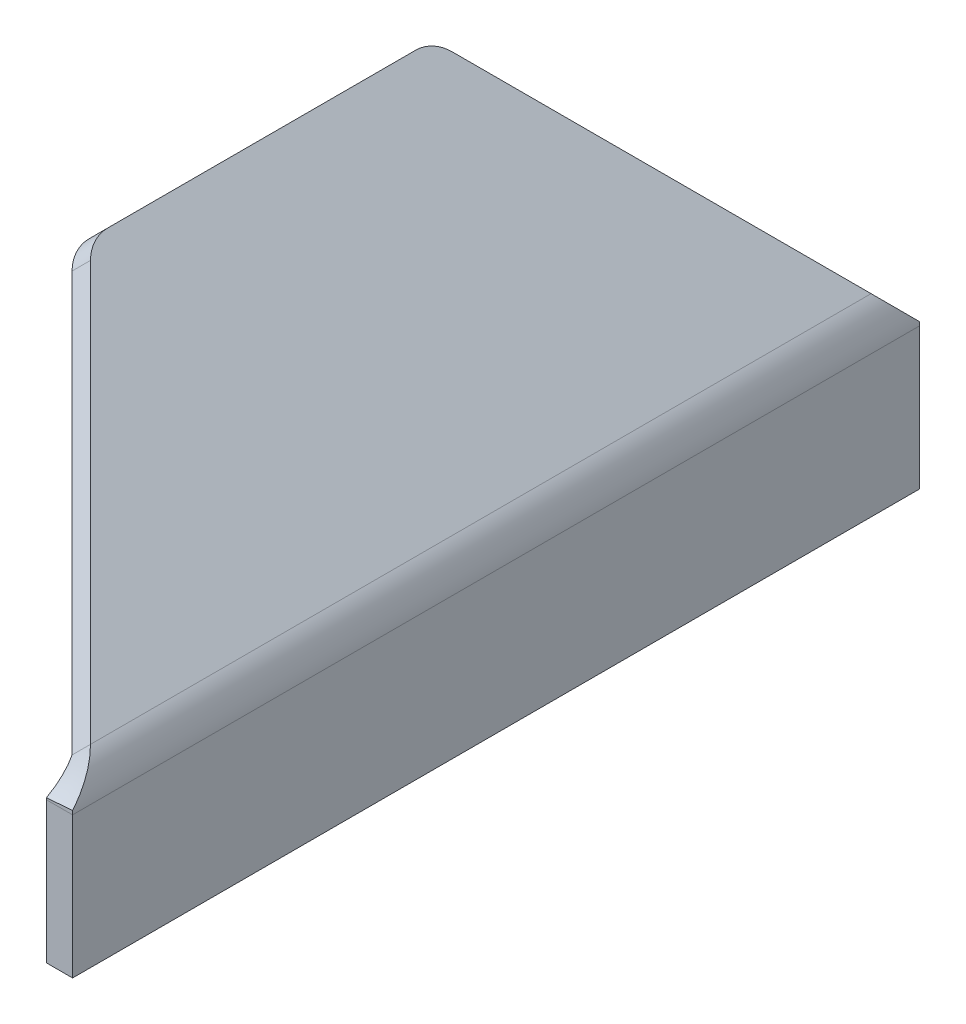
ISO-10303-21;
HEADER;
FILE_DESCRIPTION(('STEP AP214'),'2;1');
FILE_NAME('part.step','',(''),(''),'','','');
FILE_SCHEMA(('AUTOMOTIVE_DESIGN { 1 0 10303 214 1 1 1 1 }'));
ENDSEC;
DATA;
#1=APPLICATION_CONTEXT('core data for automotive mechanical design processes');
#2=APPLICATION_PROTOCOL_DEFINITION('international standard','automotive_design',2000,#1);
#3=PRODUCT_CONTEXT('',#1,'mechanical');
#4=PRODUCT('Part','Part','',(#3));
#5=PRODUCT_RELATED_PRODUCT_CATEGORY('part','',(#4));
#6=PRODUCT_DEFINITION_FORMATION('','',#4);
#7=PRODUCT_DEFINITION_CONTEXT('part definition',#1,'design');
#8=PRODUCT_DEFINITION('design','',#6,#7);
#9=PRODUCT_DEFINITION_SHAPE('','',#8);
#10=(LENGTH_UNIT() NAMED_UNIT(*) SI_UNIT(.MILLI.,.METRE.));
#11=(NAMED_UNIT(*) PLANE_ANGLE_UNIT() SI_UNIT($,.RADIAN.));
#12=(NAMED_UNIT(*) SI_UNIT($,.STERADIAN.) SOLID_ANGLE_UNIT());
#13=UNCERTAINTY_MEASURE_WITH_UNIT(LENGTH_MEASURE(1.E-05),#10,'distance_accuracy_value','');
#14=(GEOMETRIC_REPRESENTATION_CONTEXT(3) GLOBAL_UNCERTAINTY_ASSIGNED_CONTEXT((#13)) GLOBAL_UNIT_ASSIGNED_CONTEXT((#10,
#11,#12)) REPRESENTATION_CONTEXT('',''));
#15=CARTESIAN_POINT('',(0.,0.,0.));
#16=DIRECTION('',(0.,0.,1.));
#17=DIRECTION('',(1.,0.,0.));
#18=AXIS2_PLACEMENT_3D('',#15,#16,#17);
#19=CARTESIAN_POINT('',(0.,43.3725830020305,130.));
#20=DIRECTION('',(0.,0.,1.));
#21=DIRECTION('',(1.,0.,0.));
#22=AXIS2_PLACEMENT_3D('',#19,#20,#21);
#23=PLANE('',#22);
#24=CARTESIAN_POINT('',(-16.,43.3725830020305,130.));
#25=DIRECTION('',(0.,0.,-1.));
#26=DIRECTION('',(-1.,0.,0.));
#27=AXIS2_PLACEMENT_3D('',#24,#25,#26);
#28=CIRCLE('',#27,16.);
#29=CARTESIAN_POINT('',(0.,43.3725830020305,130.));
#30=VERTEX_POINT('',#29);
#31=CARTESIAN_POINT('',(-0.039770336467973,44.5000000000008,130.));
#32=VERTEX_POINT('',#31);
#33=EDGE_CURVE('E280',#30,#32,#28,.F.);
#34=ORIENTED_EDGE('',*,*,#33,.T.);
#35=DIRECTION('',(0.997514353970751,0.0704635623731452,0.));
#36=VECTOR('',#35,1.);
#37=CARTESIAN_POINT('',(-0.039770336467973,44.5000000000008,130.));
#38=LINE('',#37,#36);
#39=CARTESIAN_POINT('',(-8.01988516823399,43.9362915010156,130.));
#40=VERTEX_POINT('',#39);
#41=EDGE_CURVE('E270',#32,#40,#38,.F.);
#42=ORIENTED_EDGE('',*,*,#41,.T.);
#43=CARTESIAN_POINT('',(-16.,43.3725830020305,130.));
#44=DIRECTION('',(0.,0.,1.));
#45=DIRECTION('',(1.,0.,0.));
#46=AXIS2_PLACEMENT_3D('',#43,#44,#45);
#47=CIRCLE('',#46,8.);
#48=CARTESIAN_POINT('',(-8.00000000000001,43.3725830020305,130.));
#49=VERTEX_POINT('',#48);
#50=EDGE_CURVE('E306',#49,#40,#47,.T.);
#51=ORIENTED_EDGE('',*,*,#50,.F.);
#52=DIRECTION('',(-1.,0.,0.));
#53=VECTOR('',#52,1.);
#54=CARTESIAN_POINT('',(0.,43.3725830020305,130.));
#55=LINE('',#54,#53);
#56=EDGE_CURVE('E173',#30,#49,#55,.T.);
#57=ORIENTED_EDGE('',*,*,#56,.F.);
#58=EDGE_LOOP('',(#34,#42,#51,#57));
#59=FACE_BOUND('',#58,.T.);
#60=ADVANCED_FACE('F36',(#59),#23,.T.);
#61=CARTESIAN_POINT('',(-4.68629150101527,54.6862915010152,-130.));
#62=DIRECTION('',(0.,0.,-1.));
#63=DIRECTION('',(-1.,0.,0.));
#64=AXIS2_PLACEMENT_3D('',#61,#62,#63);
#65=PLANE('',#64);
#66=CARTESIAN_POINT('',(-16.,43.3725830020305,-130.));
#67=DIRECTION('',(0.,0.,1.));
#68=DIRECTION('',(1.,0.,0.));
#69=AXIS2_PLACEMENT_3D('',#66,#67,#68);
#70=CIRCLE('',#69,8.);
#71=CARTESIAN_POINT('',(-8.00000000000001,43.3725830020305,-130.));
#72=VERTEX_POINT('',#71);
#73=CARTESIAN_POINT('',(-8.01988516823399,43.9362915010157,-130.));
#74=VERTEX_POINT('',#73);
#75=EDGE_CURVE('E292',#72,#74,#70,.T.);
#76=ORIENTED_EDGE('',*,*,#75,.T.);
#77=DIRECTION('',(0.997514353970751,0.07046356237315,0.));
#78=VECTOR('',#77,1.);
#79=CARTESIAN_POINT('',(-0.039770336467973,44.5000000000009,-130.));
#80=LINE('',#79,#78);
#81=CARTESIAN_POINT('',(-0.039770336467973,44.5000000000009,-130.));
#82=VERTEX_POINT('',#81);
#83=EDGE_CURVE('E146',#82,#74,#80,.F.);
#84=ORIENTED_EDGE('',*,*,#83,.F.);
#85=CARTESIAN_POINT('',(-16.,43.3725830020305,-130.));
#86=DIRECTION('',(0.,0.,-1.));
#87=DIRECTION('',(-1.,0.,0.));
#88=AXIS2_PLACEMENT_3D('',#85,#86,#87);
#89=CIRCLE('',#88,16.);
#90=CARTESIAN_POINT('',(0.,43.3725830020305,-130.));
#91=VERTEX_POINT('',#90);
#92=EDGE_CURVE('E304',#91,#82,#89,.F.);
#93=ORIENTED_EDGE('',*,*,#92,.F.);
#94=DIRECTION('',(1.,0.,0.));
#95=VECTOR('',#94,1.);
#96=CARTESIAN_POINT('',(-8.00000000000001,43.3725830020305,-130.));
#97=LINE('',#96,#95);
#98=EDGE_CURVE('E171',#72,#91,#97,.T.);
#99=ORIENTED_EDGE('',*,*,#98,.F.);
#100=EDGE_LOOP('',(#76,#84,#93,#99));
#101=FACE_BOUND('',#100,.T.);
#102=ADVANCED_FACE('F203',(#101),#65,.T.);
#103=CARTESIAN_POINT('',(0.,50.,130.));
#104=DIRECTION('',(-0.707106781186546,-0.707106781186549,0.));
#105=DIRECTION('',(0.707106781186549,-0.707106781186546,0.));
#106=AXIS2_PLACEMENT_3D('',#103,#104,#105);
#107=PLANE('',#106);
#108=DIRECTION('',(0.577350269189625,-0.577350269189623,-0.577350269189629));
#109=VECTOR('',#108,1.);
#110=CARTESIAN_POINT('',(-73.8859514164977,123.885951416497,-50.6140485835025));
#111=LINE('',#110,#109);
#112=CARTESIAN_POINT('',(-69.0114150927734,119.011415092773,-55.4885849072269));
#113=VERTEX_POINT('',#112);
#114=CARTESIAN_POINT('',(-4.68629150101527,54.6862915010152,-119.813708498986));
#115=VERTEX_POINT('',#114);
#116=EDGE_CURVE('E137',#113,#115,#111,.T.);
#117=ORIENTED_EDGE('',*,*,#116,.F.);
#118=CARTESIAN_POINT('',(-64.9289321881348,114.928932188135,-47.3236190979496));
#119=DIRECTION('',(-0.707106781186546,-0.707106781186549,0.));
#120=DIRECTION('',(0.707106781186549,-0.707106781186546,0.));
#121=AXIS2_PLACEMENT_3D('',#118,#119,#120);
#122=CIRCLE('',#121,10.);
#123=CARTESIAN_POINT('',(-72.0000000000003,122.,-47.3236190979496));
#124=VERTEX_POINT('',#123);
#125=EDGE_CURVE('E44',#113,#124,#122,.F.);
#126=ORIENTED_EDGE('',*,*,#125,.T.);
#127=DIRECTION('',(0.,0.,-1.));
#128=VECTOR('',#127,1.);
#129=CARTESIAN_POINT('',(-72.0000000000003,122.,130.));
#130=LINE('',#129,#128);
#131=CARTESIAN_POINT('',(-72.0000000000003,122.,47.3236190979496));
#132=VERTEX_POINT('',#131);
#133=EDGE_CURVE('E162',#132,#124,#130,.T.);
#134=ORIENTED_EDGE('',*,*,#133,.F.);
#135=CARTESIAN_POINT('',(-64.9289321881348,114.928932188135,47.3236190979496));
#136=DIRECTION('',(-0.707106781186546,-0.707106781186549,0.));
#137=DIRECTION('',(0.707106781186549,-0.707106781186546,0.));
#138=AXIS2_PLACEMENT_3D('',#135,#136,#137);
#139=CIRCLE('',#138,10.);
#140=CARTESIAN_POINT('',(-69.0114150927734,119.011415092773,55.4885849072268));
#141=VERTEX_POINT('',#140);
#142=EDGE_CURVE('E51',#132,#141,#139,.F.);
#143=ORIENTED_EDGE('',*,*,#142,.T.);
#144=DIRECTION('',(-0.577350269189625,0.577350269189623,-0.577350269189629));
#145=VECTOR('',#144,1.);
#146=CARTESIAN_POINT('',(-73.8859514164977,123.885951416497,50.6140485835025));
#147=LINE('',#146,#145);
#148=CARTESIAN_POINT('',(-4.68629150101527,54.6862915010152,119.813708498985));
#149=VERTEX_POINT('',#148);
#150=EDGE_CURVE('E275',#149,#141,#147,.T.);
#151=ORIENTED_EDGE('',*,*,#150,.F.);
#152=DIRECTION('',(0.,0.,-1.));
#153=VECTOR('',#152,1.);
#154=CARTESIAN_POINT('',(-4.68629150101527,54.6862915010152,130.));
#155=LINE('',#154,#153);
#156=EDGE_CURVE('E281',#149,#115,#155,.T.);
#157=ORIENTED_EDGE('',*,*,#156,.T.);
#158=EDGE_LOOP('',(#117,#126,#134,#143,#151,#157));
#159=FACE_BOUND('',#158,.T.);
#160=ADVANCED_FACE('F185',(#159),#107,.F.);
#161=CARTESIAN_POINT('',(-77.6568542494927,116.343145750508,130.));
#162=DIRECTION('',(-0.707106781186548,0.707106781186547,0.));
#163=DIRECTION('',(-0.707106781186547,-0.707106781186548,0.));
#164=AXIS2_PLACEMENT_3D('',#161,#162,#163);
#165=PLANE('',#164);
#166=ORIENTED_EDGE('',*,*,#133,.T.);
#167=DIRECTION('',(-0.707106781186547,-0.707106781186548,0.));
#168=VECTOR('',#167,1.);
#169=CARTESIAN_POINT('',(-77.6568542494927,116.343145750508,-47.3236190979496));
#170=LINE('',#169,#168);
#171=CARTESIAN_POINT('',(-77.6568542494927,116.343145750508,-47.3236190979496));
#172=VERTEX_POINT('',#171);
#173=EDGE_CURVE('E177',#124,#172,#170,.T.);
#174=ORIENTED_EDGE('',*,*,#173,.T.);
#175=DIRECTION('',(0.,0.,-1.));
#176=VECTOR('',#175,1.);
#177=CARTESIAN_POINT('',(-77.6568542494927,116.343145750508,130.));
#178=LINE('',#177,#176);
#179=CARTESIAN_POINT('',(-77.6568542494927,116.343145750508,47.3236190979496));
#180=VERTEX_POINT('',#179);
#181=EDGE_CURVE('E159',#180,#172,#178,.T.);
#182=ORIENTED_EDGE('',*,*,#181,.F.);
#183=DIRECTION('',(-0.707106781186547,-0.707106781186548,0.));
#184=VECTOR('',#183,1.);
#185=CARTESIAN_POINT('',(-77.6568542494926,116.343145750508,47.3236190979496));
#186=LINE('',#185,#184);
#187=EDGE_CURVE('E175',#180,#132,#186,.F.);
#188=ORIENTED_EDGE('',*,*,#187,.T.);
#189=EDGE_LOOP('',(#166,#174,#182,#188));
#190=FACE_BOUND('',#189,.T.);
#191=ADVANCED_FACE('F190',(#190),#165,.T.);
#192=CARTESIAN_POINT('',(-5.65685424949237,44.3431457505076,130.));
#193=DIRECTION('',(-0.707106781186546,-0.707106781186549,0.));
#194=DIRECTION('',(0.707106781186549,-0.707106781186546,0.));
#195=AXIS2_PLACEMENT_3D('',#192,#193,#194);
#196=PLANE('',#195);
#197=ORIENTED_EDGE('',*,*,#181,.T.);
#198=CARTESIAN_POINT('',(-70.5857864376271,109.272077938642,-47.3236190979496));
#199=DIRECTION('',(-0.707106781186546,-0.707106781186549,0.));
#200=DIRECTION('',(0.707106781186549,-0.707106781186546,0.));
#201=AXIS2_PLACEMENT_3D('',#198,#199,#200);
#202=CIRCLE('',#201,10.);
#203=CARTESIAN_POINT('',(-74.6682693422658,113.354560843281,-55.4885849072268));
#204=VERTEX_POINT('',#203);
#205=EDGE_CURVE('E134',#172,#204,#202,.T.);
#206=ORIENTED_EDGE('',*,*,#205,.T.);
#207=DIRECTION('',(0.577350269189625,-0.577350269189623,-0.577350269189629));
#208=VECTOR('',#207,1.);
#209=CARTESIAN_POINT('',(-79.5428056659901,118.229097167005,-50.6140485835025));
#210=LINE('',#209,#208);
#211=CARTESIAN_POINT('',(-10.3431457505076,49.0294372515229,-119.813708498986));
#212=VERTEX_POINT('',#211);
#213=EDGE_CURVE('E127',#204,#212,#210,.T.);
#214=ORIENTED_EDGE('',*,*,#213,.T.);
#215=DIRECTION('',(0.,0.,-1.));
#216=VECTOR('',#215,1.);
#217=CARTESIAN_POINT('',(-10.3431457505076,49.0294372515229,130.));
#218=LINE('',#217,#216);
#219=CARTESIAN_POINT('',(-10.3431457505076,49.0294372515229,119.813708498985));
#220=VERTEX_POINT('',#219);
#221=EDGE_CURVE('E133',#220,#212,#218,.T.);
#222=ORIENTED_EDGE('',*,*,#221,.F.);
#223=DIRECTION('',(-0.577350269189625,0.577350269189623,-0.577350269189629));
#224=VECTOR('',#223,1.);
#225=CARTESIAN_POINT('',(-79.5428056659901,118.229097167005,50.6140485835025));
#226=LINE('',#225,#224);
#227=CARTESIAN_POINT('',(-74.6682693422658,113.354560843281,55.4885849072268));
#228=VERTEX_POINT('',#227);
#229=EDGE_CURVE('E326',#220,#228,#226,.T.);
#230=ORIENTED_EDGE('',*,*,#229,.T.);
#231=CARTESIAN_POINT('',(-70.5857864376271,109.272077938642,47.3236190979496));
#232=DIRECTION('',(-0.707106781186546,-0.707106781186549,0.));
#233=DIRECTION('',(0.707106781186549,-0.707106781186546,0.));
#234=AXIS2_PLACEMENT_3D('',#231,#232,#233);
#235=CIRCLE('',#234,10.);
#236=EDGE_CURVE('E180',#228,#180,#235,.T.);
#237=ORIENTED_EDGE('',*,*,#236,.T.);
#238=EDGE_LOOP('',(#197,#206,#214,#222,#230,#237));
#239=FACE_BOUND('',#238,.T.);
#240=ADVANCED_FACE('F130',(#239),#196,.T.);
#241=CARTESIAN_POINT('',(-16.,43.3725830020305,130.));
#242=DIRECTION('',(0.,0.,-1.));
#243=DIRECTION('',(-1.,0.,0.));
#244=AXIS2_PLACEMENT_3D('',#241,#242,#243);
#245=CYLINDRICAL_SURFACE('',#244,8.);
#246=ORIENTED_EDGE('',*,*,#221,.T.);
#247=CARTESIAN_POINT('',(-16.,43.3725830020305,-131.12741699797));
#248=DIRECTION('',(0.,-0.894427190999918,0.447213595499954));
#249=DIRECTION('',(0.,-0.447213595499954,-0.894427190999918));
#250=AXIS2_PLACEMENT_3D('',#247,#248,#249);
#251=ELLIPSE('',#250,17.8885438199985,8.);
#252=EDGE_CURVE('E142',#212,#74,#251,.F.);
#253=ORIENTED_EDGE('',*,*,#252,.T.);
#254=ORIENTED_EDGE('',*,*,#75,.F.);
#255=DIRECTION('',(0.,0.,-1.));
#256=VECTOR('',#255,1.);
#257=CARTESIAN_POINT('',(-8.00000000000001,43.3725830020305,130.));
#258=LINE('',#257,#256);
#259=EDGE_CURVE('E160',#49,#72,#258,.T.);
#260=ORIENTED_EDGE('',*,*,#259,.F.);
#261=ORIENTED_EDGE('',*,*,#50,.T.);
#262=CARTESIAN_POINT('',(-16.,43.3725830020305,131.12741699797));
#263=DIRECTION('',(0.,-0.894427190999918,-0.447213595499954));
#264=DIRECTION('',(0.,0.447213595499954,-0.894427190999918));
#265=AXIS2_PLACEMENT_3D('',#262,#263,#264);
#266=ELLIPSE('',#265,17.8885438199985,8.);
#267=EDGE_CURVE('E158',#40,#220,#266,.F.);
#268=ORIENTED_EDGE('',*,*,#267,.T.);
#269=EDGE_LOOP('',(#246,#253,#254,#260,#261,#268));
#270=FACE_BOUND('',#269,.T.);
#271=ADVANCED_FACE('F156',(#270),#245,.F.);
#272=CARTESIAN_POINT('',(-16.,43.3725830020305,130.));
#273=DIRECTION('',(0.,0.,-1.));
#274=DIRECTION('',(-1.,0.,0.));
#275=AXIS2_PLACEMENT_3D('',#272,#273,#274);
#276=CYLINDRICAL_SURFACE('',#275,16.);
#277=CARTESIAN_POINT('',(-16.,43.3725830020305,-131.12741699797));
#278=DIRECTION('',(0.,-0.707106781186551,0.707106781186544));
#279=DIRECTION('',(0.,-0.707106781186544,-0.707106781186551));
#280=AXIS2_PLACEMENT_3D('',#277,#278,#279);
#281=ELLIPSE('',#280,22.6274169979697,16.);
#282=EDGE_CURVE('E150',#115,#82,#281,.F.);
#283=ORIENTED_EDGE('',*,*,#282,.F.);
#284=ORIENTED_EDGE('',*,*,#156,.F.);
#285=CARTESIAN_POINT('',(-16.,43.3725830020305,131.12741699797));
#286=DIRECTION('',(0.,-0.707106781186551,-0.707106781186544));
#287=DIRECTION('',(0.,0.707106781186544,-0.707106781186551));
#288=AXIS2_PLACEMENT_3D('',#285,#286,#287);
#289=ELLIPSE('',#288,22.6274169979696,16.);
#290=EDGE_CURVE('E153',#32,#149,#289,.F.);
#291=ORIENTED_EDGE('',*,*,#290,.F.);
#292=ORIENTED_EDGE('',*,*,#33,.F.);
#293=DIRECTION('',(0.,0.,-1.));
#294=VECTOR('',#293,1.);
#295=CARTESIAN_POINT('',(0.,43.3725830020305,130.));
#296=LINE('',#295,#294);
#297=EDGE_CURVE('E286',#30,#91,#296,.T.);
#298=ORIENTED_EDGE('',*,*,#297,.T.);
#299=ORIENTED_EDGE('',*,*,#92,.T.);
#300=EDGE_LOOP('',(#283,#284,#291,#292,#298,#299));
#301=FACE_BOUND('',#300,.T.);
#302=ADVANCED_FACE('F215',(#301),#276,.T.);
#303=CARTESIAN_POINT('',(-10.3431457505076,49.0294372515229,130.));
#304=DIRECTION('',(0.,0.,1.));
#305=DIRECTION('',(1.,0.,0.));
#306=AXIS2_PLACEMENT_3D('',#303,#304,#305);
#307=PLANE('',#306);
#308=DIRECTION('',(0.,1.,0.));
#309=VECTOR('',#308,1.);
#310=CARTESIAN_POINT('',(0.,0.,130.));
#311=LINE('',#310,#309);
#312=CARTESIAN_POINT('',(0.,0.,130.));
#313=VERTEX_POINT('',#312);
#314=EDGE_CURVE('E284',#313,#30,#311,.T.);
#315=ORIENTED_EDGE('',*,*,#314,.T.);
#316=ORIENTED_EDGE('',*,*,#56,.T.);
#317=DIRECTION('',(0.,1.,0.));
#318=VECTOR('',#317,1.);
#319=CARTESIAN_POINT('',(-8.00000000000001,0.,130.));
#320=LINE('',#319,#318);
#321=CARTESIAN_POINT('',(-8.00000000000001,0.,130.));
#322=VERTEX_POINT('',#321);
#323=EDGE_CURVE('E331',#322,#49,#320,.T.);
#324=ORIENTED_EDGE('',*,*,#323,.F.);
#325=DIRECTION('',(-1.,0.,0.));
#326=VECTOR('',#325,1.);
#327=CARTESIAN_POINT('',(0.,0.,130.));
#328=LINE('',#327,#326);
#329=EDGE_CURVE('E288',#313,#322,#328,.T.);
#330=ORIENTED_EDGE('',*,*,#329,.F.);
#331=EDGE_LOOP('',(#315,#316,#324,#330));
#332=FACE_BOUND('',#331,.T.);
#333=ADVANCED_FACE('F212',(#332),#307,.T.);
#334=CARTESIAN_POINT('',(-8.00000000000001,0.,130.));
#335=DIRECTION('',(-1.,0.,0.));
#336=DIRECTION('',(0.,0.,1.));
#337=AXIS2_PLACEMENT_3D('',#334,#335,#336);
#338=PLANE('',#337);
#339=DIRECTION('',(0.,1.,0.));
#340=VECTOR('',#339,1.);
#341=CARTESIAN_POINT('',(-8.00000000000001,0.,-130.));
#342=LINE('',#341,#340);
#343=CARTESIAN_POINT('',(-8.00000000000001,0.,-130.));
#344=VERTEX_POINT('',#343);
#345=EDGE_CURVE('E294',#344,#72,#342,.T.);
#346=ORIENTED_EDGE('',*,*,#345,.F.);
#347=DIRECTION('',(0.,0.,-1.));
#348=VECTOR('',#347,1.);
#349=CARTESIAN_POINT('',(-8.00000000000001,0.,130.));
#350=LINE('',#349,#348);
#351=EDGE_CURVE('E165',#322,#344,#350,.T.);
#352=ORIENTED_EDGE('',*,*,#351,.F.);
#353=ORIENTED_EDGE('',*,*,#323,.T.);
#354=ORIENTED_EDGE('',*,*,#259,.T.);
#355=EDGE_LOOP('',(#346,#352,#353,#354));
#356=FACE_BOUND('',#355,.T.);
#357=ADVANCED_FACE('F214',(#356),#338,.T.);
#358=CARTESIAN_POINT('',(0.,0.,130.));
#359=DIRECTION('',(0.,-1.,0.));
#360=DIRECTION('',(0.,0.,-1.));
#361=AXIS2_PLACEMENT_3D('',#358,#359,#360);
#362=PLANE('',#361);
#363=DIRECTION('',(-1.,0.,0.));
#364=VECTOR('',#363,1.);
#365=CARTESIAN_POINT('',(0.,0.,-130.));
#366=LINE('',#365,#364);
#367=CARTESIAN_POINT('',(0.,0.,-130.));
#368=VERTEX_POINT('',#367);
#369=EDGE_CURVE('E298',#368,#344,#366,.T.);
#370=ORIENTED_EDGE('',*,*,#369,.F.);
#371=DIRECTION('',(0.,0.,-1.));
#372=VECTOR('',#371,1.);
#373=CARTESIAN_POINT('',(0.,0.,130.));
#374=LINE('',#373,#372);
#375=EDGE_CURVE('E309',#313,#368,#374,.T.);
#376=ORIENTED_EDGE('',*,*,#375,.F.);
#377=ORIENTED_EDGE('',*,*,#329,.T.);
#378=ORIENTED_EDGE('',*,*,#351,.T.);
#379=EDGE_LOOP('',(#370,#376,#377,#378));
#380=FACE_BOUND('',#379,.T.);
#381=ADVANCED_FACE('F228',(#380),#362,.T.);
#382=CARTESIAN_POINT('',(0.,0.,130.));
#383=DIRECTION('',(-1.,0.,0.));
#384=DIRECTION('',(0.,0.,1.));
#385=AXIS2_PLACEMENT_3D('',#382,#383,#384);
#386=PLANE('',#385);
#387=DIRECTION('',(0.,1.,0.));
#388=VECTOR('',#387,1.);
#389=CARTESIAN_POINT('',(0.,0.,-130.));
#390=LINE('',#389,#388);
#391=EDGE_CURVE('E301',#368,#91,#390,.T.);
#392=ORIENTED_EDGE('',*,*,#391,.T.);
#393=ORIENTED_EDGE('',*,*,#297,.F.);
#394=ORIENTED_EDGE('',*,*,#314,.F.);
#395=ORIENTED_EDGE('',*,*,#375,.T.);
#396=EDGE_LOOP('',(#392,#393,#394,#395));
#397=FACE_BOUND('',#396,.T.);
#398=ADVANCED_FACE('F232',(#397),#386,.F.);
#399=CARTESIAN_POINT('',(-16.,43.3725830020305,-130.));
#400=DIRECTION('',(0.,0.,1.));
#401=DIRECTION('',(1.,0.,0.));
#402=AXIS2_PLACEMENT_3D('',#399,#400,#401);
#403=PLANE('',#402);
#404=ORIENTED_EDGE('',*,*,#345,.T.);
#405=ORIENTED_EDGE('',*,*,#98,.T.);
#406=ORIENTED_EDGE('',*,*,#391,.F.);
#407=ORIENTED_EDGE('',*,*,#369,.T.);
#408=EDGE_LOOP('',(#404,#405,#406,#407));
#409=FACE_BOUND('',#408,.T.);
#410=ADVANCED_FACE('F236',(#409),#403,.F.);
#411=CARTESIAN_POINT('',(-73.8859514164977,123.885951416497,50.6140485835025));
#412=DIRECTION('',(-0.408248290463866,0.408248290463865,0.816496580927724));
#413=DIRECTION('',(-0.577350269189625,0.577350269189623,-0.577350269189629));
#414=AXIS2_PLACEMENT_3D('',#411,#412,#413);
#415=PLANE('',#414);
#416=ORIENTED_EDGE('',*,*,#150,.T.);
#417=DIRECTION('',(-0.707106781186547,-0.707106781186548,0.));
#418=VECTOR('',#417,1.);
#419=CARTESIAN_POINT('',(-69.0114150927735,119.011415092773,55.4885849072268));
#420=LINE('',#419,#418);
#421=EDGE_CURVE('E11',#141,#228,#420,.T.);
#422=ORIENTED_EDGE('',*,*,#421,.T.);
#423=ORIENTED_EDGE('',*,*,#229,.F.);
#424=DIRECTION('',(0.707106781186546,0.707106781186549,0.));
#425=VECTOR('',#424,1.);
#426=CARTESIAN_POINT('',(-4.68629150101527,54.6862915010152,119.813708498985));
#427=LINE('',#426,#425);
#428=EDGE_CURVE('E295',#149,#220,#427,.F.);
#429=ORIENTED_EDGE('',*,*,#428,.F.);
#430=EDGE_LOOP('',(#416,#422,#423,#429));
#431=FACE_BOUND('',#430,.T.);
#432=ADVANCED_FACE('F243',(#431),#415,.T.);
#433=CARTESIAN_POINT('',(-16.,59.3725830020305,115.12741699797));
#434=CARTESIAN_POINT('',(-16.,56.7059163353638,115.12741699797));
#435=CARTESIAN_POINT('',(-16.,54.0392496686971,115.12741699797));
#436=CARTESIAN_POINT('',(-16.,51.3725830020305,115.12741699797));
#437=CARTESIAN_POINT('',(-48.,59.3725830020305,115.12741699797));
#438=CARTESIAN_POINT('',(-42.6666666666667,56.7059163353638,115.12741699797));
#439=CARTESIAN_POINT('',(-37.3333333333334,54.0392496686972,115.12741699797));
#440=CARTESIAN_POINT('',(-32.,51.3725830020305,115.12741699797));
#441=CARTESIAN_POINT('',(-48.,27.3725830020305,147.12741699797));
#442=CARTESIAN_POINT('',(-42.6666666666667,30.0392496686971,147.127416997971));
#443=CARTESIAN_POINT('',(-37.3333333333334,32.7059163353638,147.127416997971));
#444=CARTESIAN_POINT('',(-32.,35.3725830020305,147.12741699797));
#445=CARTESIAN_POINT('',(-16.,27.3725830020305,147.12741699797));
#446=CARTESIAN_POINT('',(-16.,30.0392496686971,147.12741699797));
#447=CARTESIAN_POINT('',(-16.,32.7059163353638,147.12741699797));
#448=CARTESIAN_POINT('',(-16.,35.3725830020305,147.12741699797));
#449=CARTESIAN_POINT('',(16.,27.3725830020305,147.12741699797));
#450=CARTESIAN_POINT('',(10.6666666666667,30.0392496686971,147.127416997971));
#451=CARTESIAN_POINT('',(5.33333333333333,32.7059163353638,147.127416997971));
#452=CARTESIAN_POINT('',(0.,35.3725830020305,147.12741699797));
#453=CARTESIAN_POINT('',(16.,59.3725830020305,115.12741699797));
#454=CARTESIAN_POINT('',(10.6666666666667,56.7059163353638,115.12741699797));
#455=CARTESIAN_POINT('',(5.33333333333333,54.0392496686972,115.12741699797));
#456=CARTESIAN_POINT('',(0.,51.3725830020305,115.12741699797));
#457=CARTESIAN_POINT('',(-16.,59.3725830020305,115.12741699797));
#458=CARTESIAN_POINT('',(-16.,56.7059163353638,115.12741699797));
#459=CARTESIAN_POINT('',(-16.,54.0392496686971,115.12741699797));
#460=CARTESIAN_POINT('',(-16.,51.3725830020305,115.12741699797));
#461=(BOUNDED_SURFACE() B_SPLINE_SURFACE(3,3,((#433,#434,#435,#436),(#437,#438,#439,#440),(#441,
#442,#443,#444),(#445,#446,#447,#448),(#449,#450,#451,#452),(#453,#454,#455,#456),(#457,#458,
#459,#460)),.UNSPECIFIED.,.T.,.F.,.F.) B_SPLINE_SURFACE_WITH_KNOTS((4,3,4),(4,4),(0.,0.5,1.),
(0.,1.),.UNSPECIFIED.) GEOMETRIC_REPRESENTATION_ITEM() RATIONAL_B_SPLINE_SURFACE(((1.,1.,1.,1.),
(0.333333333333333,0.333333333333333,0.333333333333333,0.333333333333333),(0.333333333333333,
0.333333333333333,0.333333333333333,0.333333333333333),(1.,1.,1.,1.),(0.333333333333333,
0.333333333333333,0.333333333333333,0.333333333333333),(0.333333333333333,0.333333333333333,
0.333333333333333,0.333333333333333),(1.,1.,1.,1.))) REPRESENTATION_ITEM('') SURFACE());
#462=ORIENTED_EDGE('',*,*,#41,.F.);
#463=ORIENTED_EDGE('',*,*,#290,.T.);
#464=ORIENTED_EDGE('',*,*,#428,.T.);
#465=ORIENTED_EDGE('',*,*,#267,.F.);
#466=EDGE_LOOP('',(#462,#463,#464,#465));
#467=FACE_BOUND('',#466,.T.);
#468=ADVANCED_FACE('F247',(#467),#461,.T.);
#469=CARTESIAN_POINT('',(-73.8859514164977,123.885951416497,-50.6140485835025));
#470=DIRECTION('',(-0.408248290463866,0.408248290463865,-0.816496580927724));
#471=DIRECTION('',(0.577350269189625,-0.577350269189623,-0.577350269189629));
#472=AXIS2_PLACEMENT_3D('',#469,#470,#471);
#473=PLANE('',#472);
#474=ORIENTED_EDGE('',*,*,#213,.F.);
#475=DIRECTION('',(-0.707106781186547,-0.707106781186548,0.));
#476=VECTOR('',#475,1.);
#477=CARTESIAN_POINT('',(-69.0114150927734,119.011415092773,-55.4885849072269));
#478=LINE('',#477,#476);
#479=EDGE_CURVE('E59',#204,#113,#478,.F.);
#480=ORIENTED_EDGE('',*,*,#479,.T.);
#481=ORIENTED_EDGE('',*,*,#116,.T.);
#482=DIRECTION('',(0.707106781186546,0.707106781186549,0.));
#483=VECTOR('',#482,1.);
#484=CARTESIAN_POINT('',(-4.68629150101527,54.6862915010152,-119.813708498986));
#485=LINE('',#484,#483);
#486=EDGE_CURVE('E136',#115,#212,#485,.F.);
#487=ORIENTED_EDGE('',*,*,#486,.T.);
#488=EDGE_LOOP('',(#474,#480,#481,#487));
#489=FACE_BOUND('',#488,.T.);
#490=ADVANCED_FACE('F152',(#489),#473,.T.);
#491=CARTESIAN_POINT('',(-16.,27.3725830020305,-147.127416997971));
#492=CARTESIAN_POINT('',(-16.,30.0392496686971,-147.127416997971));
#493=CARTESIAN_POINT('',(-16.,32.7059163353638,-147.127416997971));
#494=CARTESIAN_POINT('',(-16.,35.3725830020305,-147.127416997971));
#495=CARTESIAN_POINT('',(-48.,27.3725830020305,-147.127416997971));
#496=CARTESIAN_POINT('',(-42.6666666666667,30.0392496686971,-147.127416997971));
#497=CARTESIAN_POINT('',(-37.3333333333333,32.7059163353638,-147.127416997971));
#498=CARTESIAN_POINT('',(-32.,35.3725830020305,-147.127416997971));
#499=CARTESIAN_POINT('',(-48.,59.3725830020305,-115.12741699797));
#500=CARTESIAN_POINT('',(-42.6666666666667,56.7059163353638,-115.12741699797));
#501=CARTESIAN_POINT('',(-37.3333333333333,54.0392496686972,-115.12741699797));
#502=CARTESIAN_POINT('',(-32.,51.3725830020305,-115.12741699797));
#503=CARTESIAN_POINT('',(-16.,59.3725830020305,-115.12741699797));
#504=CARTESIAN_POINT('',(-16.,56.7059163353638,-115.12741699797));
#505=CARTESIAN_POINT('',(-16.,54.0392496686971,-115.12741699797));
#506=CARTESIAN_POINT('',(-16.,51.3725830020305,-115.12741699797));
#507=CARTESIAN_POINT('',(16.,59.3725830020305,-115.12741699797));
#508=CARTESIAN_POINT('',(10.6666666666667,56.7059163353638,-115.12741699797));
#509=CARTESIAN_POINT('',(5.33333333333333,54.0392496686972,-115.12741699797));
#510=CARTESIAN_POINT('',(0.,51.3725830020305,-115.12741699797));
#511=CARTESIAN_POINT('',(16.,27.3725830020305,-147.127416997971));
#512=CARTESIAN_POINT('',(10.6666666666667,30.0392496686971,-147.127416997971));
#513=CARTESIAN_POINT('',(5.33333333333333,32.7059163353638,-147.127416997971));
#514=CARTESIAN_POINT('',(0.,35.3725830020305,-147.127416997971));
#515=CARTESIAN_POINT('',(-16.,27.3725830020305,-147.127416997971));
#516=CARTESIAN_POINT('',(-16.,30.0392496686971,-147.127416997971));
#517=CARTESIAN_POINT('',(-16.,32.7059163353638,-147.127416997971));
#518=CARTESIAN_POINT('',(-16.,35.3725830020305,-147.127416997971));
#519=(BOUNDED_SURFACE() B_SPLINE_SURFACE(3,3,((#491,#492,#493,#494),(#495,#496,#497,#498),(#499,
#500,#501,#502),(#503,#504,#505,#506),(#507,#508,#509,#510),(#511,#512,#513,#514),(#515,#516,
#517,#518)),.UNSPECIFIED.,.T.,.F.,.F.) B_SPLINE_SURFACE_WITH_KNOTS((4,3,4),(4,4),(0.,0.5,1.),
(0.,1.),.UNSPECIFIED.) GEOMETRIC_REPRESENTATION_ITEM() RATIONAL_B_SPLINE_SURFACE(((1.,1.,1.,1.),
(0.333333333333333,0.333333333333333,0.333333333333333,0.333333333333333),(0.333333333333333,
0.333333333333333,0.333333333333333,0.333333333333333),(1.,1.,1.,1.),(0.333333333333333,
0.333333333333333,0.333333333333333,0.333333333333333),(0.333333333333333,0.333333333333333,
0.333333333333333,0.333333333333333),(1.,1.,1.,1.))) REPRESENTATION_ITEM('') SURFACE());
#520=ORIENTED_EDGE('',*,*,#486,.F.);
#521=ORIENTED_EDGE('',*,*,#282,.T.);
#522=ORIENTED_EDGE('',*,*,#83,.T.);
#523=ORIENTED_EDGE('',*,*,#252,.F.);
#524=EDGE_LOOP('',(#520,#521,#522,#523));
#525=FACE_BOUND('',#524,.T.);
#526=ADVANCED_FACE('F143',(#525),#519,.T.);
#527=CARTESIAN_POINT('',(-70.5857864376272,109.272077938642,-47.3236190979496));
#528=DIRECTION('',(-0.707106781186547,-0.707106781186548,0.));
#529=DIRECTION('',(0.707106781186548,-0.707106781186547,0.));
#530=AXIS2_PLACEMENT_3D('',#527,#528,#529);
#531=CYLINDRICAL_SURFACE('',#530,10.);
#532=ORIENTED_EDGE('',*,*,#125,.F.);
#533=ORIENTED_EDGE('',*,*,#479,.F.);
#534=ORIENTED_EDGE('',*,*,#205,.F.);
#535=ORIENTED_EDGE('',*,*,#173,.F.);
#536=EDGE_LOOP('',(#532,#533,#534,#535));
#537=FACE_BOUND('',#536,.T.);
#538=ADVANCED_FACE('F193',(#537),#531,.T.);
#539=CARTESIAN_POINT('',(-64.9289321881348,114.928932188135,47.3236190979496));
#540=DIRECTION('',(-0.707106781186547,-0.707106781186548,0.));
#541=DIRECTION('',(0.707106781186548,-0.707106781186547,0.));
#542=AXIS2_PLACEMENT_3D('',#539,#540,#541);
#543=CYLINDRICAL_SURFACE('',#542,10.);
#544=ORIENTED_EDGE('',*,*,#142,.F.);
#545=ORIENTED_EDGE('',*,*,#187,.F.);
#546=ORIENTED_EDGE('',*,*,#236,.F.);
#547=ORIENTED_EDGE('',*,*,#421,.F.);
#548=EDGE_LOOP('',(#544,#545,#546,#547));
#549=FACE_BOUND('',#548,.T.);
#550=ADVANCED_FACE('F38',(#549),#543,.T.);
#551=CLOSED_SHELL('',(#60,#102,#160,#191,#240,#271,#302,#333,#357,#381,#398,#410,#432,#468,#490,
#526,#538,#550));
#552=MANIFOLD_SOLID_BREP('B2',#551);
#553=ADVANCED_BREP_SHAPE_REPRESENTATION('',(#18,#552),#14);
#554=SHAPE_DEFINITION_REPRESENTATION(#9,#553);
ENDSEC;
END-ISO-10303-21;
